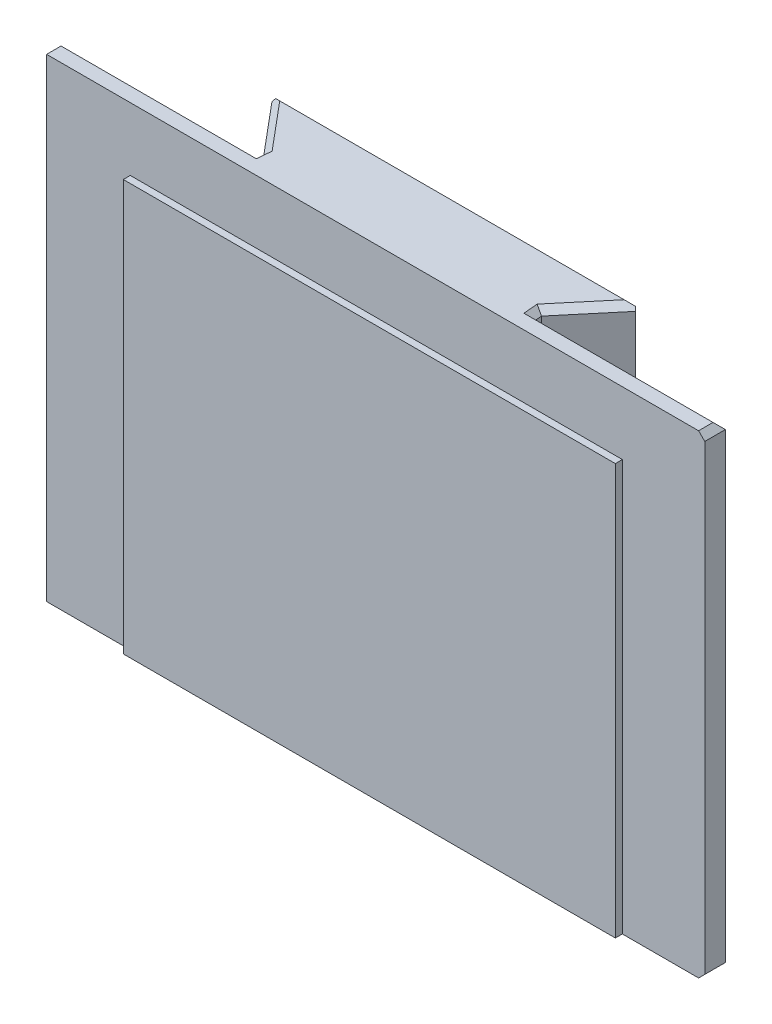
ISO-10303-21;
HEADER;
FILE_DESCRIPTION(('STEP AP214'),'2;1');
FILE_NAME('part.step','',(''),(''),'','','');
FILE_SCHEMA(('AUTOMOTIVE_DESIGN { 1 0 10303 214 1 1 1 1 }'));
ENDSEC;
DATA;
#1=APPLICATION_CONTEXT('core data for automotive mechanical design processes');
#2=APPLICATION_PROTOCOL_DEFINITION('international standard','automotive_design',2000,#1);
#3=PRODUCT_CONTEXT('',#1,'mechanical');
#4=PRODUCT('Part','Part','',(#3));
#5=PRODUCT_RELATED_PRODUCT_CATEGORY('part','',(#4));
#6=PRODUCT_DEFINITION_FORMATION('','',#4);
#7=PRODUCT_DEFINITION_CONTEXT('part definition',#1,'design');
#8=PRODUCT_DEFINITION('design','',#6,#7);
#9=PRODUCT_DEFINITION_SHAPE('','',#8);
#10=(LENGTH_UNIT() NAMED_UNIT(*) SI_UNIT(.MILLI.,.METRE.));
#11=(NAMED_UNIT(*) PLANE_ANGLE_UNIT() SI_UNIT($,.RADIAN.));
#12=(NAMED_UNIT(*) SI_UNIT($,.STERADIAN.) SOLID_ANGLE_UNIT());
#13=UNCERTAINTY_MEASURE_WITH_UNIT(LENGTH_MEASURE(1.E-05),#10,'distance_accuracy_value','');
#14=(GEOMETRIC_REPRESENTATION_CONTEXT(3) GLOBAL_UNCERTAINTY_ASSIGNED_CONTEXT((#13)) GLOBAL_UNIT_ASSIGNED_CONTEXT((#10,
#11,#12)) REPRESENTATION_CONTEXT('',''));
#15=CARTESIAN_POINT('',(0.,0.,0.));
#16=DIRECTION('',(0.,0.,1.));
#17=DIRECTION('',(1.,0.,0.));
#18=AXIS2_PLACEMENT_3D('',#15,#16,#17);
#19=CARTESIAN_POINT('',(0.,0.,-16.));
#20=DIRECTION('',(0.,0.,-1.));
#21=DIRECTION('',(-1.,0.,0.));
#22=AXIS2_PLACEMENT_3D('',#19,#20,#21);
#23=PLANE('',#22);
#24=DIRECTION('',(0.,1.,0.));
#25=VECTOR('',#24,1.);
#26=CARTESIAN_POINT('',(139.416621160774,109.497,-16.));
#27=LINE('',#26,#25);
#28=CARTESIAN_POINT('',(139.416621160774,-4.00299999999999,-16.));
#29=VERTEX_POINT('',#28);
#30=CARTESIAN_POINT('',(139.416621160774,107.997,-16.));
#31=VERTEX_POINT('',#30);
#32=EDGE_CURVE('E298',#29,#31,#27,.T.);
#33=ORIENTED_EDGE('',*,*,#32,.T.);
#34=DIRECTION('',(1.,0.,0.));
#35=VECTOR('',#34,1.);
#36=CARTESIAN_POINT('',(185.4335,107.997,-16.));
#37=LINE('',#36,#35);
#38=CARTESIAN_POINT('',(185.4335,107.997,-16.));
#39=VERTEX_POINT('',#38);
#40=EDGE_CURVE('E364',#31,#39,#37,.T.);
#41=ORIENTED_EDGE('',*,*,#40,.T.);
#42=DIRECTION('',(0.,-1.,0.));
#43=VECTOR('',#42,1.);
#44=CARTESIAN_POINT('',(185.4335,109.497,-16.));
#45=LINE('',#44,#43);
#46=CARTESIAN_POINT('',(185.4335,-4.00299999999999,-16.));
#47=VERTEX_POINT('',#46);
#48=EDGE_CURVE('E245',#39,#47,#45,.T.);
#49=ORIENTED_EDGE('',*,*,#48,.T.);
#50=DIRECTION('',(-1.,0.,0.));
#51=VECTOR('',#50,1.);
#52=CARTESIAN_POINT('',(139.416621160774,-4.00299999999999,-16.));
#53=LINE('',#52,#51);
#54=EDGE_CURVE('E362',#47,#29,#53,.T.);
#55=ORIENTED_EDGE('',*,*,#54,.T.);
#56=EDGE_LOOP('',(#33,#41,#49,#55));
#57=FACE_BOUND('',#56,.T.);
#58=ADVANCED_FACE('F41',(#57),#23,.T.);
#59=CARTESIAN_POINT('',(46.0335,-5.50299999999999,-166.552081310409));
#60=DIRECTION('',(1.,0.,0.));
#61=DIRECTION('',(0.,1.,0.));
#62=AXIS2_PLACEMENT_3D('',#59,#60,#61);
#63=PLANE('',#62);
#64=DIRECTION('',(0.,1.,0.));
#65=VECTOR('',#64,1.);
#66=CARTESIAN_POINT('',(46.0335,-5.50299999999999,-11.));
#67=LINE('',#66,#65);
#68=CARTESIAN_POINT('',(46.0335,-5.50299999999999,-11.));
#69=VERTEX_POINT('',#68);
#70=CARTESIAN_POINT('',(46.0335,94.197,-11.));
#71=VERTEX_POINT('',#70);
#72=EDGE_CURVE('E253',#69,#71,#67,.T.);
#73=ORIENTED_EDGE('',*,*,#72,.F.);
#74=DIRECTION('',(0.,0.,1.));
#75=VECTOR('',#74,1.);
#76=CARTESIAN_POINT('',(46.0335,-5.50299999999999,-166.552081310409));
#77=LINE('',#76,#75);
#78=CARTESIAN_POINT('',(46.0335,-5.50299999999999,-9.3));
#79=VERTEX_POINT('',#78);
#80=EDGE_CURVE('E227',#69,#79,#77,.T.);
#81=ORIENTED_EDGE('',*,*,#80,.T.);
#82=DIRECTION('',(0.,1.,0.));
#83=VECTOR('',#82,1.);
#84=CARTESIAN_POINT('',(46.0335,-5.50299999999999,-9.3));
#85=LINE('',#84,#83);
#86=CARTESIAN_POINT('',(46.0335,94.197,-9.3));
#87=VERTEX_POINT('',#86);
#88=EDGE_CURVE('E263',#79,#87,#85,.T.);
#89=ORIENTED_EDGE('',*,*,#88,.T.);
#90=DIRECTION('',(0.,0.,1.));
#91=VECTOR('',#90,1.);
#92=CARTESIAN_POINT('',(46.0335,94.197,-166.552081310409));
#93=LINE('',#92,#91);
#94=EDGE_CURVE('E262',#71,#87,#93,.T.);
#95=ORIENTED_EDGE('',*,*,#94,.F.);
#96=EDGE_LOOP('',(#73,#81,#89,#95));
#97=FACE_BOUND('',#96,.T.);
#98=ADVANCED_FACE('F453',(#97),#63,.F.);
#99=CARTESIAN_POINT('',(46.0335,94.197,-166.552081310409));
#100=DIRECTION('',(0.,-1.,0.));
#101=DIRECTION('',(0.,0.,-1.));
#102=AXIS2_PLACEMENT_3D('',#99,#100,#101);
#103=PLANE('',#102);
#104=DIRECTION('',(1.,0.,0.));
#105=VECTOR('',#104,1.);
#106=CARTESIAN_POINT('',(46.0335,94.197,-11.));
#107=LINE('',#106,#105);
#108=CARTESIAN_POINT('',(165.4335,94.197,-11.));
#109=VERTEX_POINT('',#108);
#110=EDGE_CURVE('E270',#71,#109,#107,.T.);
#111=ORIENTED_EDGE('',*,*,#110,.F.);
#112=ORIENTED_EDGE('',*,*,#94,.T.);
#113=DIRECTION('',(1.,0.,0.));
#114=VECTOR('',#113,1.);
#115=CARTESIAN_POINT('',(46.0335,94.197,-9.3));
#116=LINE('',#115,#114);
#117=CARTESIAN_POINT('',(165.4335,94.197,-9.3));
#118=VERTEX_POINT('',#117);
#119=EDGE_CURVE('E259',#87,#118,#116,.T.);
#120=ORIENTED_EDGE('',*,*,#119,.T.);
#121=DIRECTION('',(0.,0.,1.));
#122=VECTOR('',#121,1.);
#123=CARTESIAN_POINT('',(165.4335,94.197,-166.552081310409));
#124=LINE('',#123,#122);
#125=EDGE_CURVE('E258',#109,#118,#124,.T.);
#126=ORIENTED_EDGE('',*,*,#125,.F.);
#127=EDGE_LOOP('',(#111,#112,#120,#126));
#128=FACE_BOUND('',#127,.T.);
#129=ADVANCED_FACE('F444',(#128),#103,.F.);
#130=CARTESIAN_POINT('',(165.4335,94.197,-166.552081310409));
#131=DIRECTION('',(-1.,0.,0.));
#132=DIRECTION('',(0.,-1.,0.));
#133=AXIS2_PLACEMENT_3D('',#130,#131,#132);
#134=PLANE('',#133);
#135=DIRECTION('',(0.,-1.,0.));
#136=VECTOR('',#135,1.);
#137=CARTESIAN_POINT('',(165.4335,94.197,-11.));
#138=LINE('',#137,#136);
#139=CARTESIAN_POINT('',(165.4335,-5.50299999999999,-11.));
#140=VERTEX_POINT('',#139);
#141=EDGE_CURVE('E266',#109,#140,#138,.T.);
#142=ORIENTED_EDGE('',*,*,#141,.F.);
#143=ORIENTED_EDGE('',*,*,#125,.T.);
#144=DIRECTION('',(0.,-1.,0.));
#145=VECTOR('',#144,1.);
#146=CARTESIAN_POINT('',(165.4335,94.197,-9.3));
#147=LINE('',#146,#145);
#148=CARTESIAN_POINT('',(165.4335,-5.50299999999999,-9.3));
#149=VERTEX_POINT('',#148);
#150=EDGE_CURVE('E255',#118,#149,#147,.T.);
#151=ORIENTED_EDGE('',*,*,#150,.T.);
#152=DIRECTION('',(0.,0.,1.));
#153=VECTOR('',#152,1.);
#154=CARTESIAN_POINT('',(165.4335,-5.50299999999999,-166.552081310409));
#155=LINE('',#154,#153);
#156=EDGE_CURVE('E254',#140,#149,#155,.T.);
#157=ORIENTED_EDGE('',*,*,#156,.F.);
#158=EDGE_LOOP('',(#142,#143,#151,#157));
#159=FACE_BOUND('',#158,.T.);
#160=ADVANCED_FACE('F442',(#159),#134,.F.);
#161=CARTESIAN_POINT('',(165.4335,-5.50299999999999,-166.552081310409));
#162=DIRECTION('',(0.,1.,0.));
#163=DIRECTION('',(0.,0.,1.));
#164=AXIS2_PLACEMENT_3D('',#161,#162,#163);
#165=PLANE('',#164);
#166=DIRECTION('',(0.,0.,1.));
#167=VECTOR('',#166,1.);
#168=CARTESIAN_POINT('',(25.7335,-5.50299999999999,-16.));
#169=LINE('',#168,#167);
#170=CARTESIAN_POINT('',(25.7335,-5.50299999999999,-14.5));
#171=VERTEX_POINT('',#170);
#172=CARTESIAN_POINT('',(25.7335,-5.50299999999999,-11.));
#173=VERTEX_POINT('',#172);
#174=EDGE_CURVE('E218',#171,#173,#169,.T.);
#175=ORIENTED_EDGE('',*,*,#174,.F.);
#176=DIRECTION('',(1.,0.,0.));
#177=VECTOR('',#176,1.);
#178=CARTESIAN_POINT('',(71.7503788392264,-5.50299999999999,-14.5));
#179=LINE('',#178,#177);
#180=CARTESIAN_POINT('',(73.1248756002525,-5.50299999999999,-14.5));
#181=VERTEX_POINT('',#180);
#182=EDGE_CURVE('E12',#171,#181,#179,.T.);
#183=ORIENTED_EDGE('',*,*,#182,.T.);
#184=DIRECTION('',(0.0871557427476643,0.,-0.996194698091745));
#185=VECTOR('',#184,1.);
#186=CARTESIAN_POINT('',(87.0278467257539,-5.50299999999999,-173.41168712825));
#187=LINE('',#186,#185);
#188=CARTESIAN_POINT('',(73.4328629314511,-5.50299999999999,-18.0203113041871));
#189=VERTEX_POINT('',#188);
#190=EDGE_CURVE('E51',#181,#189,#187,.T.);
#191=ORIENTED_EDGE('',*,*,#190,.T.);
#192=DIRECTION('',(-0.642787609686543,0.,-0.766044443118975));
#193=VECTOR('',#192,1.);
#194=CARTESIAN_POINT('',(62.6450780011525,-5.50299999999999,-30.8766927510039));
#195=LINE('',#194,#193);
#196=CARTESIAN_POINT('',(63.8002603807643,-5.50299999999999,-29.5));
#197=VERTEX_POINT('',#196);
#198=EDGE_CURVE('E384',#189,#197,#195,.T.);
#199=ORIENTED_EDGE('',*,*,#198,.T.);
#200=DIRECTION('',(1.,0.,0.));
#201=VECTOR('',#200,1.);
#202=CARTESIAN_POINT('',(148.5835,-5.50299999999999,-29.5));
#203=LINE('',#202,#201);
#204=CARTESIAN_POINT('',(147.366739619236,-5.50299999999999,-29.5));
#205=VERTEX_POINT('',#204);
#206=EDGE_CURVE('E382',#197,#205,#203,.T.);
#207=ORIENTED_EDGE('',*,*,#206,.T.);
#208=DIRECTION('',(-0.642787609686543,0.,0.766044443118975));
#209=VECTOR('',#208,1.);
#210=CARTESIAN_POINT('',(138.133514087035,-5.50299999999999,-18.4962703007677));
#211=LINE('',#210,#209);
#212=CARTESIAN_POINT('',(137.734137068549,-5.50299999999999,-18.0203113041871));
#213=VERTEX_POINT('',#212);
#214=EDGE_CURVE('E380',#205,#213,#211,.T.);
#215=ORIENTED_EDGE('',*,*,#214,.T.);
#216=DIRECTION('',(0.0871557427476733,0.,0.996194698091744));
#217=VECTOR('',#216,1.);
#218=CARTESIAN_POINT('',(125.048409256464,-5.50299999999999,-163.018843694883));
#219=LINE('',#218,#217);
#220=CARTESIAN_POINT('',(138.042124399748,-5.50299999999999,-14.5));
#221=VERTEX_POINT('',#220);
#222=EDGE_CURVE('E378',#213,#221,#219,.T.);
#223=ORIENTED_EDGE('',*,*,#222,.T.);
#224=DIRECTION('',(1.,0.,0.));
#225=VECTOR('',#224,1.);
#226=CARTESIAN_POINT('',(185.4335,-5.50299999999999,-14.5));
#227=LINE('',#226,#225);
#228=CARTESIAN_POINT('',(183.9335,-5.50299999999999,-14.5));
#229=VERTEX_POINT('',#228);
#230=EDGE_CURVE('E376',#221,#229,#227,.T.);
#231=ORIENTED_EDGE('',*,*,#230,.T.);
#232=DIRECTION('',(0.,0.,1.));
#233=VECTOR('',#232,1.);
#234=CARTESIAN_POINT('',(183.9335,-5.50299999999999,-166.552081310409));
#235=LINE('',#234,#233);
#236=CARTESIAN_POINT('',(183.9335,-5.50299999999999,-11.));
#237=VERTEX_POINT('',#236);
#238=EDGE_CURVE('E374',#229,#237,#235,.T.);
#239=ORIENTED_EDGE('',*,*,#238,.T.);
#240=DIRECTION('',(-1.,0.,0.));
#241=VECTOR('',#240,1.);
#242=CARTESIAN_POINT('',(185.4335,-5.50299999999999,-11.));
#243=LINE('',#242,#241);
#244=EDGE_CURVE('E237',#237,#140,#243,.T.);
#245=ORIENTED_EDGE('',*,*,#244,.T.);
#246=ORIENTED_EDGE('',*,*,#156,.T.);
#247=DIRECTION('',(-1.,0.,0.));
#248=VECTOR('',#247,1.);
#249=CARTESIAN_POINT('',(165.4335,-5.50299999999999,-9.3));
#250=LINE('',#249,#248);
#251=EDGE_CURVE('E251',#149,#79,#250,.T.);
#252=ORIENTED_EDGE('',*,*,#251,.T.);
#253=ORIENTED_EDGE('',*,*,#80,.F.);
#254=EDGE_CURVE('E231',#69,#173,#243,.T.);
#255=ORIENTED_EDGE('',*,*,#254,.T.);
#256=EDGE_LOOP('',(#175,#183,#191,#199,#207,#215,#223,#231,#239,#245,#246,#252,#253,#255));
#257=FACE_BOUND('',#256,.T.);
#258=ADVANCED_FACE('F232',(#257),#165,.F.);
#259=CARTESIAN_POINT('',(0.,0.,-9.3));
#260=DIRECTION('',(0.,0.,-1.));
#261=DIRECTION('',(-1.,0.,0.));
#262=AXIS2_PLACEMENT_3D('',#259,#260,#261);
#263=PLANE('',#262);
#264=ORIENTED_EDGE('',*,*,#88,.F.);
#265=ORIENTED_EDGE('',*,*,#251,.F.);
#266=ORIENTED_EDGE('',*,*,#150,.F.);
#267=ORIENTED_EDGE('',*,*,#119,.F.);
#268=EDGE_LOOP('',(#264,#265,#266,#267));
#269=FACE_BOUND('',#268,.T.);
#270=ADVANCED_FACE('F451',(#269),#263,.F.);
#271=CARTESIAN_POINT('',(0.,0.,-11.));
#272=DIRECTION('',(0.,0.,-1.));
#273=DIRECTION('',(-1.,0.,0.));
#274=AXIS2_PLACEMENT_3D('',#271,#272,#273);
#275=PLANE('',#274);
#276=DIRECTION('',(0.,-1.,0.));
#277=VECTOR('',#276,1.);
#278=CARTESIAN_POINT('',(185.4335,109.497,-11.));
#279=LINE('',#278,#277);
#280=CARTESIAN_POINT('',(185.4335,107.997,-11.));
#281=VERTEX_POINT('',#280);
#282=CARTESIAN_POINT('',(185.4335,-4.00299999999999,-11.));
#283=VERTEX_POINT('',#282);
#284=EDGE_CURVE('E238',#281,#283,#279,.T.);
#285=ORIENTED_EDGE('',*,*,#284,.F.);
#286=DIRECTION('',(0.707106781186548,-0.707106781186548,0.));
#287=VECTOR('',#286,1.);
#288=CARTESIAN_POINT('',(185.4335,107.997,-11.));
#289=LINE('',#288,#287);
#290=CARTESIAN_POINT('',(183.9335,109.497,-11.));
#291=VERTEX_POINT('',#290);
#292=EDGE_CURVE('E372',#281,#291,#289,.F.);
#293=ORIENTED_EDGE('',*,*,#292,.T.);
#294=DIRECTION('',(1.,0.,0.));
#295=VECTOR('',#294,1.);
#296=CARTESIAN_POINT('',(185.4335,109.497,-11.));
#297=LINE('',#296,#295);
#298=CARTESIAN_POINT('',(25.7335,109.497,-11.));
#299=VERTEX_POINT('',#298);
#300=EDGE_CURVE('E243',#299,#291,#297,.T.);
#301=ORIENTED_EDGE('',*,*,#300,.F.);
#302=DIRECTION('',(0.,1.,0.));
#303=VECTOR('',#302,1.);
#304=CARTESIAN_POINT('',(25.7335,109.497,-11.));
#305=LINE('',#304,#303);
#306=EDGE_CURVE('E223',#173,#299,#305,.T.);
#307=ORIENTED_EDGE('',*,*,#306,.F.);
#308=ORIENTED_EDGE('',*,*,#254,.F.);
#309=ORIENTED_EDGE('',*,*,#72,.T.);
#310=ORIENTED_EDGE('',*,*,#110,.T.);
#311=ORIENTED_EDGE('',*,*,#141,.T.);
#312=ORIENTED_EDGE('',*,*,#244,.F.);
#313=DIRECTION('',(-0.707106781186548,-0.707106781186548,0.));
#314=VECTOR('',#313,1.);
#315=CARTESIAN_POINT('',(183.9335,-5.50299999999999,-11.));
#316=LINE('',#315,#314);
#317=EDGE_CURVE('E370',#237,#283,#316,.F.);
#318=ORIENTED_EDGE('',*,*,#317,.T.);
#319=EDGE_LOOP('',(#285,#293,#301,#307,#308,#309,#310,#311,#312,#318));
#320=FACE_BOUND('',#319,.T.);
#321=ADVANCED_FACE('F241',(#320),#275,.F.);
#322=CARTESIAN_POINT('',(185.4335,109.497,-16.));
#323=DIRECTION('',(-1.,0.,0.));
#324=DIRECTION('',(0.,0.,1.));
#325=AXIS2_PLACEMENT_3D('',#322,#323,#324);
#326=PLANE('',#325);
#327=ORIENTED_EDGE('',*,*,#48,.F.);
#328=DIRECTION('',(0.,0.,1.));
#329=VECTOR('',#328,1.);
#330=CARTESIAN_POINT('',(185.4335,107.997,-16.));
#331=LINE('',#330,#329);
#332=EDGE_CURVE('E368',#39,#281,#331,.T.);
#333=ORIENTED_EDGE('',*,*,#332,.T.);
#334=ORIENTED_EDGE('',*,*,#284,.T.);
#335=DIRECTION('',(0.,0.,-1.));
#336=VECTOR('',#335,1.);
#337=CARTESIAN_POINT('',(185.4335,-4.00299999999999,-16.));
#338=LINE('',#337,#336);
#339=EDGE_CURVE('E366',#283,#47,#338,.T.);
#340=ORIENTED_EDGE('',*,*,#339,.T.);
#341=EDGE_LOOP('',(#327,#333,#334,#340));
#342=FACE_BOUND('',#341,.T.);
#343=ADVANCED_FACE('F709',(#342),#326,.F.);
#344=CARTESIAN_POINT('',(25.7335,109.497,-16.));
#345=DIRECTION('',(1.,0.,0.));
#346=DIRECTION('',(0.,1.,0.));
#347=AXIS2_PLACEMENT_3D('',#344,#345,#346);
#348=PLANE('',#347);
#349=DIRECTION('',(0.,0.,1.));
#350=VECTOR('',#349,1.);
#351=CARTESIAN_POINT('',(25.7335,109.497,-16.));
#352=LINE('',#351,#350);
#353=CARTESIAN_POINT('',(25.7335,109.497,-14.5));
#354=VERTEX_POINT('',#353);
#355=EDGE_CURVE('E228',#354,#299,#352,.T.);
#356=ORIENTED_EDGE('',*,*,#355,.F.);
#357=DIRECTION('',(0.,-0.707106781186548,-0.707106781186548));
#358=VECTOR('',#357,1.);
#359=CARTESIAN_POINT('',(25.7335,107.997,-16.));
#360=LINE('',#359,#358);
#361=CARTESIAN_POINT('',(25.7335,107.997,-16.));
#362=VERTEX_POINT('',#361);
#363=EDGE_CURVE('E324',#354,#362,#360,.T.);
#364=ORIENTED_EDGE('',*,*,#363,.T.);
#365=DIRECTION('',(0.,1.,0.));
#366=VECTOR('',#365,1.);
#367=CARTESIAN_POINT('',(25.7335,109.497,-16.));
#368=LINE('',#367,#366);
#369=CARTESIAN_POINT('',(25.7335,-4.00299999999999,-16.));
#370=VERTEX_POINT('',#369);
#371=EDGE_CURVE('E249',#370,#362,#368,.T.);
#372=ORIENTED_EDGE('',*,*,#371,.F.);
#373=DIRECTION('',(0.,-0.707106781186544,0.707106781186551));
#374=VECTOR('',#373,1.);
#375=CARTESIAN_POINT('',(25.7335,-4.003,-16.));
#376=LINE('',#375,#374);
#377=EDGE_CURVE('E226',#370,#171,#376,.T.);
#378=ORIENTED_EDGE('',*,*,#377,.T.);
#379=ORIENTED_EDGE('',*,*,#174,.T.);
#380=ORIENTED_EDGE('',*,*,#306,.T.);
#381=EDGE_LOOP('',(#356,#364,#372,#378,#379,#380));
#382=FACE_BOUND('',#381,.T.);
#383=ADVANCED_FACE('F221',(#382),#348,.F.);
#384=CARTESIAN_POINT('',(185.4335,109.497,-16.));
#385=DIRECTION('',(0.,-1.,0.));
#386=DIRECTION('',(0.,0.,-1.));
#387=AXIS2_PLACEMENT_3D('',#384,#385,#386);
#388=PLANE('',#387);
#389=DIRECTION('',(-0.0871557427476643,0.,0.996194698091745));
#390=VECTOR('',#389,1.);
#391=CARTESIAN_POINT('',(74.1082219138729,109.497,-25.7396997964078));
#392=LINE('',#391,#390);
#393=CARTESIAN_POINT('',(73.4328629314511,109.497,-18.0203113041871));
#394=VERTEX_POINT('',#393);
#395=CARTESIAN_POINT('',(73.1248756002525,109.497,-14.5));
#396=VERTEX_POINT('',#395);
#397=EDGE_CURVE('E319',#394,#396,#392,.T.);
#398=ORIENTED_EDGE('',*,*,#397,.T.);
#399=DIRECTION('',(-1.,0.,0.));
#400=VECTOR('',#399,1.);
#401=CARTESIAN_POINT('',(25.7335,109.497,-14.5));
#402=LINE('',#401,#400);
#403=EDGE_CURVE('E321',#396,#354,#402,.T.);
#404=ORIENTED_EDGE('',*,*,#403,.T.);
#405=ORIENTED_EDGE('',*,*,#355,.T.);
#406=ORIENTED_EDGE('',*,*,#300,.T.);
#407=DIRECTION('',(0.,0.,-1.));
#408=VECTOR('',#407,1.);
#409=CARTESIAN_POINT('',(183.9335,109.497,-16.));
#410=LINE('',#409,#408);
#411=CARTESIAN_POINT('',(183.9335,109.497,-14.5));
#412=VERTEX_POINT('',#411);
#413=EDGE_CURVE('E307',#291,#412,#410,.T.);
#414=ORIENTED_EDGE('',*,*,#413,.T.);
#415=DIRECTION('',(-1.,0.,0.));
#416=VECTOR('',#415,1.);
#417=CARTESIAN_POINT('',(139.416621160774,109.497,-14.5));
#418=LINE('',#417,#416);
#419=CARTESIAN_POINT('',(138.042124399748,109.497,-14.5));
#420=VERTEX_POINT('',#419);
#421=EDGE_CURVE('E309',#412,#420,#418,.T.);
#422=ORIENTED_EDGE('',*,*,#421,.T.);
#423=DIRECTION('',(-0.0871557427476733,0.,-0.996194698091744));
#424=VECTOR('',#423,1.);
#425=CARTESIAN_POINT('',(138.271879008103,109.497,-11.873892809702));
#426=LINE('',#425,#424);
#427=CARTESIAN_POINT('',(137.734137068549,109.497,-18.0203113041871));
#428=VERTEX_POINT('',#427);
#429=EDGE_CURVE('E311',#420,#428,#426,.T.);
#430=ORIENTED_EDGE('',*,*,#429,.T.);
#431=DIRECTION('',(0.642787609686543,0.,-0.766044443118975));
#432=VECTOR('',#431,1.);
#433=CARTESIAN_POINT('',(148.521921998847,109.497,-30.8766927510039));
#434=LINE('',#433,#432);
#435=CARTESIAN_POINT('',(147.366739619236,109.497,-29.5));
#436=VERTEX_POINT('',#435);
#437=EDGE_CURVE('E313',#428,#436,#434,.T.);
#438=ORIENTED_EDGE('',*,*,#437,.T.);
#439=DIRECTION('',(-1.,0.,0.));
#440=VECTOR('',#439,1.);
#441=CARTESIAN_POINT('',(62.5835,109.497,-29.5));
#442=LINE('',#441,#440);
#443=CARTESIAN_POINT('',(63.8002603807643,109.497,-29.5));
#444=VERTEX_POINT('',#443);
#445=EDGE_CURVE('E315',#436,#444,#442,.T.);
#446=ORIENTED_EDGE('',*,*,#445,.T.);
#447=DIRECTION('',(0.642787609686543,0.,0.766044443118975));
#448=VECTOR('',#447,1.);
#449=CARTESIAN_POINT('',(73.0334859129647,109.497,-18.4962703007677));
#450=LINE('',#449,#448);
#451=EDGE_CURVE('E317',#444,#394,#450,.T.);
#452=ORIENTED_EDGE('',*,*,#451,.T.);
#453=EDGE_LOOP('',(#398,#404,#405,#406,#414,#422,#430,#438,#446,#452));
#454=FACE_BOUND('',#453,.T.);
#455=ADVANCED_FACE('F693',(#454),#388,.F.);
#456=ORIENTED_EDGE('',*,*,#371,.T.);
#457=DIRECTION('',(1.,0.,0.));
#458=VECTOR('',#457,1.);
#459=CARTESIAN_POINT('',(71.7503788392264,107.997,-16.));
#460=LINE('',#459,#458);
#461=CARTESIAN_POINT('',(71.7503788392264,107.997,-16.));
#462=VERTEX_POINT('',#461);
#463=EDGE_CURVE('E304',#362,#462,#460,.T.);
#464=ORIENTED_EDGE('',*,*,#463,.T.);
#465=DIRECTION('',(0.,-1.,0.));
#466=VECTOR('',#465,1.);
#467=CARTESIAN_POINT('',(71.7503788392264,-5.50299999999999,-16.));
#468=LINE('',#467,#466);
#469=CARTESIAN_POINT('',(71.7503788392264,-4.00299999999999,-16.));
#470=VERTEX_POINT('',#469);
#471=EDGE_CURVE('E283',#462,#470,#468,.T.);
#472=ORIENTED_EDGE('',*,*,#471,.T.);
#473=DIRECTION('',(-1.,0.,0.));
#474=VECTOR('',#473,1.);
#475=CARTESIAN_POINT('',(25.7335,-4.00299999999999,-16.));
#476=LINE('',#475,#474);
#477=EDGE_CURVE('E301',#470,#370,#476,.T.);
#478=ORIENTED_EDGE('',*,*,#477,.T.);
#479=EDGE_LOOP('',(#456,#464,#472,#478));
#480=FACE_BOUND('',#479,.T.);
#481=ADVANCED_FACE('F463',(#480),#23,.T.);
#482=CARTESIAN_POINT('',(60.5835,-96.7444379544733,-31.));
#483=DIRECTION('',(-0.766044443118975,0.,0.642787609686543));
#484=DIRECTION('',(0.642787609686543,0.,0.766044443118975));
#485=AXIS2_PLACEMENT_3D('',#482,#483,#484);
#486=PLANE('',#485);
#487=DIRECTION('',(0.,1.,0.));
#488=VECTOR('',#487,1.);
#489=CARTESIAN_POINT('',(71.8844192482863,109.497,-17.5320888862379));
#490=LINE('',#489,#488);
#491=CARTESIAN_POINT('',(71.8844192482863,-4.00299999999999,-17.5320888862379));
#492=VERTEX_POINT('',#491);
#493=CARTESIAN_POINT('',(71.8844192482863,107.997,-17.5320888862379));
#494=VERTEX_POINT('',#493);
#495=EDGE_CURVE('E280',#492,#494,#490,.T.);
#496=ORIENTED_EDGE('',*,*,#495,.T.);
#497=DIRECTION('',(-0.642787609686543,0.,-0.766044443118975));
#498=VECTOR('',#497,1.);
#499=CARTESIAN_POINT('',(61.4960113364741,107.997,-29.9125113364741));
#500=LINE('',#499,#498);
#501=CARTESIAN_POINT('',(61.4960113364741,107.997,-29.9125113364741));
#502=VERTEX_POINT('',#501);
#503=EDGE_CURVE('E332',#494,#502,#500,.T.);
#504=ORIENTED_EDGE('',*,*,#503,.T.);
#505=DIRECTION('',(0.,-1.,0.));
#506=VECTOR('',#505,1.);
#507=CARTESIAN_POINT('',(61.4960113364741,-96.7444379544733,-29.9125113364741));
#508=LINE('',#507,#506);
#509=CARTESIAN_POINT('',(61.4960113364741,-4.00299999999999,-29.9125113364741));
#510=VERTEX_POINT('',#509);
#511=EDGE_CURVE('E269',#502,#510,#508,.T.);
#512=ORIENTED_EDGE('',*,*,#511,.T.);
#513=DIRECTION('',(0.642787609686543,0.,0.766044443118975));
#514=VECTOR('',#513,1.);
#515=CARTESIAN_POINT('',(71.8844192482863,-4.003,-17.5320888862379));
#516=LINE('',#515,#514);
#517=EDGE_CURVE('E330',#510,#492,#516,.T.);
#518=ORIENTED_EDGE('',*,*,#517,.T.);
#519=EDGE_LOOP('',(#496,#504,#512,#518));
#520=FACE_BOUND('',#519,.T.);
#521=ADVANCED_FACE('F676',(#520),#486,.T.);
#522=CARTESIAN_POINT('',(150.5835,-96.7444379544733,-31.));
#523=DIRECTION('',(0.,0.,-1.));
#524=DIRECTION('',(-1.,0.,0.));
#525=AXIS2_PLACEMENT_3D('',#522,#523,#524);
#526=PLANE('',#525);
#527=DIRECTION('',(0.,1.,0.));
#528=VECTOR('',#527,1.);
#529=CARTESIAN_POINT('',(62.5835,-96.7444379544733,-31.));
#530=LINE('',#529,#528);
#531=CARTESIAN_POINT('',(62.5835,-4.00299999999999,-31.));
#532=VERTEX_POINT('',#531);
#533=CARTESIAN_POINT('',(62.5835,107.997,-31.));
#534=VERTEX_POINT('',#533);
#535=EDGE_CURVE('E289',#532,#534,#530,.T.);
#536=ORIENTED_EDGE('',*,*,#535,.T.);
#537=DIRECTION('',(1.,0.,0.));
#538=VECTOR('',#537,1.);
#539=CARTESIAN_POINT('',(148.5835,107.997,-31.));
#540=LINE('',#539,#538);
#541=CARTESIAN_POINT('',(148.5835,107.997,-31.));
#542=VERTEX_POINT('',#541);
#543=EDGE_CURVE('E344',#534,#542,#540,.T.);
#544=ORIENTED_EDGE('',*,*,#543,.T.);
#545=DIRECTION('',(0.,-1.,0.));
#546=VECTOR('',#545,1.);
#547=CARTESIAN_POINT('',(148.5835,-96.7444379544733,-31.));
#548=LINE('',#547,#546);
#549=CARTESIAN_POINT('',(148.5835,-4.00299999999999,-31.));
#550=VERTEX_POINT('',#549);
#551=EDGE_CURVE('E286',#542,#550,#548,.T.);
#552=ORIENTED_EDGE('',*,*,#551,.T.);
#553=DIRECTION('',(-1.,0.,0.));
#554=VECTOR('',#553,1.);
#555=CARTESIAN_POINT('',(62.5835,-4.00299999999999,-31.));
#556=LINE('',#555,#554);
#557=EDGE_CURVE('E342',#550,#532,#556,.T.);
#558=ORIENTED_EDGE('',*,*,#557,.T.);
#559=EDGE_LOOP('',(#536,#544,#552,#558));
#560=FACE_BOUND('',#559,.T.);
#561=ADVANCED_FACE('F667',(#560),#526,.T.);
#562=CARTESIAN_POINT('',(137.997005532341,-96.7444379544733,-16.));
#563=DIRECTION('',(0.766044443118975,0.,0.642787609686543));
#564=DIRECTION('',(0.642787609686543,0.,-0.766044443118975));
#565=AXIS2_PLACEMENT_3D('',#562,#563,#564);
#566=PLANE('',#565);
#567=DIRECTION('',(0.,1.,0.));
#568=VECTOR('',#567,1.);
#569=CARTESIAN_POINT('',(149.670988663526,-96.7444379544733,-29.9125113364741));
#570=LINE('',#569,#568);
#571=CARTESIAN_POINT('',(149.670988663526,-4.00299999999999,-29.9125113364741));
#572=VERTEX_POINT('',#571);
#573=CARTESIAN_POINT('',(149.670988663526,107.997,-29.9125113364741));
#574=VERTEX_POINT('',#573);
#575=EDGE_CURVE('E295',#572,#574,#570,.T.);
#576=ORIENTED_EDGE('',*,*,#575,.T.);
#577=DIRECTION('',(-0.642787609686543,0.,0.766044443118975));
#578=VECTOR('',#577,1.);
#579=CARTESIAN_POINT('',(139.282580751714,107.997,-17.5320888862379));
#580=LINE('',#579,#578);
#581=CARTESIAN_POINT('',(139.282580751714,107.997,-17.5320888862379));
#582=VERTEX_POINT('',#581);
#583=EDGE_CURVE('E356',#574,#582,#580,.T.);
#584=ORIENTED_EDGE('',*,*,#583,.T.);
#585=DIRECTION('',(0.,-1.,0.));
#586=VECTOR('',#585,1.);
#587=CARTESIAN_POINT('',(139.282580751714,-5.50299999999999,-17.5320888862379));
#588=LINE('',#587,#586);
#589=CARTESIAN_POINT('',(139.282580751714,-4.00299999999999,-17.5320888862379));
#590=VERTEX_POINT('',#589);
#591=EDGE_CURVE('E292',#582,#590,#588,.T.);
#592=ORIENTED_EDGE('',*,*,#591,.T.);
#593=DIRECTION('',(0.642787609686543,0.,-0.766044443118975));
#594=VECTOR('',#593,1.);
#595=CARTESIAN_POINT('',(149.670988663526,-4.00299999999999,-29.9125113364741));
#596=LINE('',#595,#594);
#597=EDGE_CURVE('E354',#590,#572,#596,.T.);
#598=ORIENTED_EDGE('',*,*,#597,.T.);
#599=EDGE_LOOP('',(#576,#584,#592,#598));
#600=FACE_BOUND('',#599,.T.);
#601=ADVANCED_FACE('F474',(#600),#566,.T.);
#602=CARTESIAN_POINT('',(71.8844192482863,-96.7444379544733,-17.5320888862379));
#603=DIRECTION('',(-0.996194698091745,0.,-0.0871557427476643));
#604=DIRECTION('',(0.,-1.,0.));
#605=AXIS2_PLACEMENT_3D('',#602,#603,#604);
#606=PLANE('',#605);
#607=ORIENTED_EDGE('',*,*,#471,.F.);
#608=DIRECTION('',(-0.0871557427476643,0.,0.996194698091745));
#609=VECTOR('',#608,1.);
#610=CARTESIAN_POINT('',(71.8844192482863,107.997,-17.5320888862379));
#611=LINE('',#610,#609);
#612=EDGE_CURVE('E328',#462,#494,#611,.F.);
#613=ORIENTED_EDGE('',*,*,#612,.T.);
#614=ORIENTED_EDGE('',*,*,#495,.F.);
#615=DIRECTION('',(0.0871557427476643,0.,-0.996194698091745));
#616=VECTOR('',#615,1.);
#617=CARTESIAN_POINT('',(71.8844192482863,-4.00299999999999,-17.5320888862379));
#618=LINE('',#617,#616);
#619=EDGE_CURVE('E326',#492,#470,#618,.F.);
#620=ORIENTED_EDGE('',*,*,#619,.T.);
#621=EDGE_LOOP('',(#607,#613,#614,#620));
#622=FACE_BOUND('',#621,.T.);
#623=ADVANCED_FACE('F467',(#622),#606,.T.);
#624=CARTESIAN_POINT('',(62.5835,-96.7444379544733,-31.));
#625=DIRECTION('',(0.707106781186543,0.,0.707106781186552));
#626=DIRECTION('',(0.,1.,0.));
#627=AXIS2_PLACEMENT_3D('',#624,#625,#626);
#628=PLANE('',#627);
#629=ORIENTED_EDGE('',*,*,#511,.F.);
#630=DIRECTION('',(-0.500952228764616,-0.705757556807956,0.500952228764609));
#631=VECTOR('',#630,1.);
#632=CARTESIAN_POINT('',(-10.3446747754983,6.78553870991271,41.9281747754974));
#633=LINE('',#632,#631);
#634=CARTESIAN_POINT('',(61.9474702342662,108.633029765734,-30.3639702342662));
#635=VERTEX_POINT('',#634);
#636=EDGE_CURVE('E340',#502,#635,#633,.F.);
#637=ORIENTED_EDGE('',*,*,#636,.T.);
#638=DIRECTION('',(-0.577350269189631,0.577350269189623,0.577350269189623));
#639=VECTOR('',#638,1.);
#640=CARTESIAN_POINT('',(130.830645984825,39.7498540151762,-99.2471459848238));
#641=LINE('',#640,#639);
#642=EDGE_CURVE('E338',#635,#534,#641,.F.);
#643=ORIENTED_EDGE('',*,*,#642,.T.);
#644=ORIENTED_EDGE('',*,*,#535,.F.);
#645=DIRECTION('',(0.577350269189631,0.577350269189623,-0.577350269189623));
#646=VECTOR('',#645,1.);
#647=CARTESIAN_POINT('',(31.6696873485088,-34.9168126514908,-0.0861873485091744));
#648=LINE('',#647,#646);
#649=CARTESIAN_POINT('',(61.9474702342662,-4.63902976573378,-30.3639702342662));
#650=VERTEX_POINT('',#649);
#651=EDGE_CURVE('E334',#532,#650,#648,.F.);
#652=ORIENTED_EDGE('',*,*,#651,.T.);
#653=DIRECTION('',(0.500952228764615,-0.705757556807956,-0.500952228764609));
#654=VECTOR('',#653,1.);
#655=CARTESIAN_POINT('',(94.8306402505485,-50.965893682526,-63.2471402505481));
#656=LINE('',#655,#654);
#657=EDGE_CURVE('E336',#650,#510,#656,.F.);
#658=ORIENTED_EDGE('',*,*,#657,.T.);
#659=EDGE_LOOP('',(#629,#637,#643,#644,#652,#658));
#660=FACE_BOUND('',#659,.T.);
#661=ADVANCED_FACE('F473',(#660),#628,.F.);
#662=CARTESIAN_POINT('',(149.670988663526,-96.7444379544733,-29.9125113364741));
#663=DIRECTION('',(-0.707106781186538,0.,0.707106781186556));
#664=DIRECTION('',(0.,1.,0.));
#665=AXIS2_PLACEMENT_3D('',#662,#663,#664);
#666=PLANE('',#665);
#667=ORIENTED_EDGE('',*,*,#551,.F.);
#668=DIRECTION('',(-0.577350269189636,-0.577350269189621,-0.577350269189621));
#669=VECTOR('',#668,1.);
#670=CARTESIAN_POINT('',(81.0613464575256,40.4748464575274,-98.5221535424726));
#671=LINE('',#670,#669);
#672=CARTESIAN_POINT('',(149.219529765734,108.633029765734,-30.3639702342662));
#673=VERTEX_POINT('',#672);
#674=EDGE_CURVE('E352',#542,#673,#671,.F.);
#675=ORIENTED_EDGE('',*,*,#674,.T.);
#676=DIRECTION('',(-0.500952228764619,0.705757556807955,-0.500952228764607));
#677=VECTOR('',#676,1.);
#678=CARTESIAN_POINT('',(222.057492155373,6.01657369016766,42.4739921553712));
#679=LINE('',#678,#677);
#680=EDGE_CURVE('E350',#673,#574,#679,.F.);
#681=ORIENTED_EDGE('',*,*,#680,.T.);
#682=ORIENTED_EDGE('',*,*,#575,.F.);
#683=DIRECTION('',(0.500952228764619,0.705757556807956,0.500952228764606));
#684=VECTOR('',#683,1.);
#685=CARTESIAN_POINT('',(116.882177129326,-50.1969286627806,-62.7013228706736));
#686=LINE('',#685,#684);
#687=CARTESIAN_POINT('',(149.219529765734,-4.6390297657338,-30.3639702342662));
#688=VERTEX_POINT('',#687);
#689=EDGE_CURVE('E346',#572,#688,#686,.F.);
#690=ORIENTED_EDGE('',*,*,#689,.T.);
#691=DIRECTION('',(0.577350269189636,-0.577350269189621,0.577350269189621));
#692=VECTOR('',#691,1.);
#693=CARTESIAN_POINT('',(180.222305093842,-35.6418050938412,0.638805093841181));
#694=LINE('',#693,#692);
#695=EDGE_CURVE('E348',#688,#550,#694,.F.);
#696=ORIENTED_EDGE('',*,*,#695,.T.);
#697=EDGE_LOOP('',(#667,#675,#681,#682,#690,#696));
#698=FACE_BOUND('',#697,.T.);
#699=ADVANCED_FACE('F481',(#698),#666,.F.);
#700=CARTESIAN_POINT('',(139.416621160774,0.,-16.));
#701=DIRECTION('',(0.996194698091744,0.,-0.0871557427476733));
#702=DIRECTION('',(0.,-1.,0.));
#703=AXIS2_PLACEMENT_3D('',#700,#701,#702);
#704=PLANE('',#703);
#705=ORIENTED_EDGE('',*,*,#591,.F.);
#706=DIRECTION('',(-0.0871557427476733,0.,-0.996194698091744));
#707=VECTOR('',#706,1.);
#708=CARTESIAN_POINT('',(139.416621160774,107.997,-16.));
#709=LINE('',#708,#707);
#710=EDGE_CURVE('E360',#582,#31,#709,.F.);
#711=ORIENTED_EDGE('',*,*,#710,.T.);
#712=ORIENTED_EDGE('',*,*,#32,.F.);
#713=DIRECTION('',(0.0871557427476733,0.,0.996194698091744));
#714=VECTOR('',#713,1.);
#715=CARTESIAN_POINT('',(139.416621160774,-4.00299999999999,-16.));
#716=LINE('',#715,#714);
#717=EDGE_CURVE('E358',#29,#590,#716,.F.);
#718=ORIENTED_EDGE('',*,*,#717,.T.);
#719=EDGE_LOOP('',(#705,#711,#712,#718));
#720=FACE_BOUND('',#719,.T.);
#721=ADVANCED_FACE('F488',(#720),#704,.T.);
#722=CARTESIAN_POINT('',(185.4335,107.997,-16.));
#723=DIRECTION('',(-0.707106781186547,-0.707106781186547,0.));
#724=DIRECTION('',(0.,0.,1.));
#725=AXIS2_PLACEMENT_3D('',#722,#723,#724);
#726=PLANE('',#725);
#727=ORIENTED_EDGE('',*,*,#292,.F.);
#728=ORIENTED_EDGE('',*,*,#332,.F.);
#729=DIRECTION('',(0.577350269189626,-0.577350269189626,-0.577350269189626));
#730=VECTOR('',#729,1.);
#731=CARTESIAN_POINT('',(185.4335,107.997,-16.));
#732=LINE('',#731,#730);
#733=EDGE_CURVE('E404',#412,#39,#732,.T.);
#734=ORIENTED_EDGE('',*,*,#733,.F.);
#735=ORIENTED_EDGE('',*,*,#413,.F.);
#736=EDGE_LOOP('',(#727,#728,#734,#735));
#737=FACE_BOUND('',#736,.T.);
#738=ADVANCED_FACE('F495',(#737),#726,.F.);
#739=CARTESIAN_POINT('',(0.,107.997,-16.));
#740=DIRECTION('',(0.,0.707106781186547,-0.707106781186547));
#741=DIRECTION('',(-1.,0.,0.));
#742=AXIS2_PLACEMENT_3D('',#739,#740,#741);
#743=PLANE('',#742);
#744=ORIENTED_EDGE('',*,*,#733,.T.);
#745=ORIENTED_EDGE('',*,*,#40,.F.);
#746=DIRECTION('',(-0.543774795917189,0.59342605745165,0.59342605745165));
#747=VECTOR('',#746,1.);
#748=CARTESIAN_POINT('',(137.262641896983,110.347655881702,-13.6493441182981));
#749=LINE('',#748,#747);
#750=EDGE_CURVE('E401',#420,#31,#749,.F.);
#751=ORIENTED_EDGE('',*,*,#750,.F.);
#752=ORIENTED_EDGE('',*,*,#421,.F.);
#753=EDGE_LOOP('',(#744,#745,#751,#752));
#754=FACE_BOUND('',#753,.T.);
#755=ADVANCED_FACE('F539',(#754),#743,.T.);
#756=CARTESIAN_POINT('',(138.271879008103,109.497,-11.873892809702));
#757=DIRECTION('',(0.70441602640276,0.707106781186545,-0.0616284167162302));
#758=DIRECTION('',(0.0871557427476733,0.,0.996194698091744));
#759=AXIS2_PLACEMENT_3D('',#756,#757,#758);
#760=PLANE('',#759);
#761=ORIENTED_EDGE('',*,*,#750,.T.);
#762=ORIENTED_EDGE('',*,*,#710,.F.);
#763=DIRECTION('',(-0.7005142133454,0.678598344545848,-0.220871283060315));
#764=VECTOR('',#763,1.);
#765=CARTESIAN_POINT('',(143.466579450127,103.943899383003,-16.2128791639569));
#766=LINE('',#765,#764);
#767=EDGE_CURVE('E398',#428,#582,#766,.F.);
#768=ORIENTED_EDGE('',*,*,#767,.F.);
#769=ORIENTED_EDGE('',*,*,#429,.F.);
#770=EDGE_LOOP('',(#761,#762,#768,#769));
#771=FACE_BOUND('',#770,.T.);
#772=ADVANCED_FACE('F532',(#771),#760,.T.);
#773=CARTESIAN_POINT('',(156.447555691884,109.497,-40.3220951782657));
#774=DIRECTION('',(0.541675220419701,0.707106781186545,0.454519477672048));
#775=DIRECTION('',(-0.642787609686543,0.,0.766044443118975));
#776=AXIS2_PLACEMENT_3D('',#773,#774,#775);
#777=PLANE('',#776);
#778=ORIENTED_EDGE('',*,*,#583,.F.);
#779=ORIENTED_EDGE('',*,*,#680,.F.);
#780=DIRECTION('',(-0.834817129478988,0.389281620635024,0.389281620635024));
#781=VECTOR('',#780,1.);
#782=CARTESIAN_POINT('',(157.212291975728,104.905943537402,-34.0910564625984));
#783=LINE('',#782,#781);
#784=EDGE_CURVE('E395',#436,#673,#783,.F.);
#785=ORIENTED_EDGE('',*,*,#784,.F.);
#786=ORIENTED_EDGE('',*,*,#437,.F.);
#787=ORIENTED_EDGE('',*,*,#767,.T.);
#788=EDGE_LOOP('',(#778,#779,#785,#786,#787));
#789=FACE_BOUND('',#788,.T.);
#790=ADVANCED_FACE('F525',(#789),#777,.T.);
#791=CARTESIAN_POINT('',(185.4335,109.497,-29.5));
#792=DIRECTION('',(0.,0.707106781186547,-0.707106781186547));
#793=DIRECTION('',(1.,0.,0.));
#794=AXIS2_PLACEMENT_3D('',#791,#792,#793);
#795=PLANE('',#794);
#796=ORIENTED_EDGE('',*,*,#543,.F.);
#797=ORIENTED_EDGE('',*,*,#642,.F.);
#798=DIRECTION('',(0.834817129478988,0.389281620635025,0.389281620635025));
#799=VECTOR('',#798,1.);
#800=CARTESIAN_POINT('',(148.568853908284,149.025244332911,10.0282443329105));
#801=LINE('',#800,#799);
#802=EDGE_CURVE('E392',#444,#635,#801,.F.);
#803=ORIENTED_EDGE('',*,*,#802,.F.);
#804=ORIENTED_EDGE('',*,*,#445,.F.);
#805=ORIENTED_EDGE('',*,*,#784,.T.);
#806=ORIENTED_EDGE('',*,*,#674,.F.);
#807=EDGE_LOOP('',(#796,#797,#803,#804,#805,#806));
#808=FACE_BOUND('',#807,.T.);
#809=ADVANCED_FACE('F518',(#808),#795,.T.);
#810=CARTESIAN_POINT('',(120.703637321413,109.497,38.3148038997593));
#811=DIRECTION('',(-0.541675220419702,0.707106781186544,0.454519477672049));
#812=DIRECTION('',(-0.642787609686543,0.,-0.766044443118975));
#813=AXIS2_PLACEMENT_3D('',#810,#811,#812);
#814=PLANE('',#813);
#815=ORIENTED_EDGE('',*,*,#636,.F.);
#816=ORIENTED_EDGE('',*,*,#503,.F.);
#817=DIRECTION('',(0.7005142133454,0.678598344545849,-0.220871283060313));
#818=VECTOR('',#817,1.);
#819=CARTESIAN_POINT('',(74.9586457992077,110.975048137312,-18.501388794483));
#820=LINE('',#819,#818);
#821=EDGE_CURVE('E389',#394,#494,#820,.F.);
#822=ORIENTED_EDGE('',*,*,#821,.F.);
#823=ORIENTED_EDGE('',*,*,#451,.F.);
#824=ORIENTED_EDGE('',*,*,#802,.T.);
#825=EDGE_LOOP('',(#815,#816,#822,#823,#824));
#826=FACE_BOUND('',#825,.T.);
#827=ADVANCED_FACE('F511',(#826),#814,.T.);
#828=CARTESIAN_POINT('',(74.1082219138729,109.497,-25.7396997964078));
#829=DIRECTION('',(-0.70441602640276,0.707106781186546,-0.0616284167162238));
#830=DIRECTION('',(0.0871557427476643,0.,-0.996194698091745));
#831=AXIS2_PLACEMENT_3D('',#828,#829,#830);
#832=PLANE('',#831);
#833=ORIENTED_EDGE('',*,*,#821,.T.);
#834=ORIENTED_EDGE('',*,*,#612,.F.);
#835=DIRECTION('',(0.543774795917194,0.593426057451648,0.593426057451648));
#836=VECTOR('',#835,1.);
#837=CARTESIAN_POINT('',(50.5344355124499,84.8438606892847,-39.1531393107153));
#838=LINE('',#837,#836);
#839=EDGE_CURVE('E387',#396,#462,#838,.F.);
#840=ORIENTED_EDGE('',*,*,#839,.F.);
#841=ORIENTED_EDGE('',*,*,#397,.F.);
#842=EDGE_LOOP('',(#833,#834,#840,#841));
#843=FACE_BOUND('',#842,.T.);
#844=ADVANCED_FACE('F504',(#843),#832,.T.);
#845=CARTESIAN_POINT('',(0.,107.997,-16.));
#846=DIRECTION('',(0.,0.707106781186547,-0.707106781186547));
#847=DIRECTION('',(-1.,0.,0.));
#848=AXIS2_PLACEMENT_3D('',#845,#846,#847);
#849=PLANE('',#848);
#850=ORIENTED_EDGE('',*,*,#363,.F.);
#851=ORIENTED_EDGE('',*,*,#403,.F.);
#852=ORIENTED_EDGE('',*,*,#839,.T.);
#853=ORIENTED_EDGE('',*,*,#463,.F.);
#854=EDGE_LOOP('',(#850,#851,#852,#853));
#855=FACE_BOUND('',#854,.T.);
#856=ADVANCED_FACE('F498',(#855),#849,.T.);
#857=CARTESIAN_POINT('',(183.9335,-5.50299999999999,-166.552081310409));
#858=DIRECTION('',(-0.707106781186547,0.707106781186547,0.));
#859=DIRECTION('',(0.,0.,1.));
#860=AXIS2_PLACEMENT_3D('',#857,#858,#859);
#861=PLANE('',#860);
#862=ORIENTED_EDGE('',*,*,#317,.F.);
#863=ORIENTED_EDGE('',*,*,#238,.F.);
#864=DIRECTION('',(-0.577350269189624,-0.577350269189624,0.577350269189629));
#865=VECTOR('',#864,1.);
#866=CARTESIAN_POINT('',(234.61752710347,45.1810271034698,-65.1840271034702));
#867=LINE('',#866,#865);
#868=EDGE_CURVE('E46',#47,#229,#867,.T.);
#869=ORIENTED_EDGE('',*,*,#868,.F.);
#870=ORIENTED_EDGE('',*,*,#339,.F.);
#871=EDGE_LOOP('',(#862,#863,#869,#870));
#872=FACE_BOUND('',#871,.T.);
#873=ADVANCED_FACE('F44',(#872),#861,.F.);
#874=CARTESIAN_POINT('',(0.,-4.00299999999999,-16.));
#875=DIRECTION('',(0.,-0.707106781186551,-0.707106781186544));
#876=DIRECTION('',(1.,0.,0.));
#877=AXIS2_PLACEMENT_3D('',#874,#875,#876);
#878=PLANE('',#877);
#879=ORIENTED_EDGE('',*,*,#868,.T.);
#880=ORIENTED_EDGE('',*,*,#230,.F.);
#881=DIRECTION('',(0.543774795917184,0.59342605745165,-0.593426057451656));
#882=VECTOR('',#881,1.);
#883=CARTESIAN_POINT('',(182.125564869619,42.6056333411539,-62.6086333411543));
#884=LINE('',#883,#882);
#885=EDGE_CURVE('E421',#29,#221,#884,.F.);
#886=ORIENTED_EDGE('',*,*,#885,.F.);
#887=ORIENTED_EDGE('',*,*,#54,.F.);
#888=EDGE_LOOP('',(#879,#880,#886,#887));
#889=FACE_BOUND('',#888,.T.);
#890=ADVANCED_FACE('F432',(#889),#878,.T.);
#891=CARTESIAN_POINT('',(125.048409256464,-5.50299999999999,-163.018843694883));
#892=DIRECTION('',(0.704416026402763,-0.707106781186542,-0.0616284167162305));
#893=DIRECTION('',(-0.0871557427476733,0.,-0.996194698091744));
#894=AXIS2_PLACEMENT_3D('',#891,#892,#893);
#895=PLANE('',#894);
#896=ORIENTED_EDGE('',*,*,#885,.T.);
#897=ORIENTED_EDGE('',*,*,#222,.F.);
#898=DIRECTION('',(0.700514213345397,0.67859834454585,0.220871283060319));
#899=VECTOR('',#898,1.);
#900=CARTESIAN_POINT('',(163.644064934252,19.5963253555861,-9.850942428189));
#901=LINE('',#900,#899);
#902=EDGE_CURVE('E419',#590,#213,#901,.F.);
#903=ORIENTED_EDGE('',*,*,#902,.F.);
#904=ORIENTED_EDGE('',*,*,#717,.F.);
#905=EDGE_LOOP('',(#896,#897,#903,#904));
#906=FACE_BOUND('',#905,.T.);
#907=ADVANCED_FACE('F586',(#906),#895,.T.);
#908=CARTESIAN_POINT('',(222.316465921861,-5.50299999999999,-118.821605585105));
#909=DIRECTION('',(0.541675220419702,-0.707106781186544,0.454519477672049));
#910=DIRECTION('',(0.642787609686543,0.,-0.766044443118975));
#911=AXIS2_PLACEMENT_3D('',#908,#909,#910);
#912=PLANE('',#911);
#913=ORIENTED_EDGE('',*,*,#902,.T.);
#914=ORIENTED_EDGE('',*,*,#214,.F.);
#915=DIRECTION('',(0.834817129478988,0.389281620635025,-0.389281620635025));
#916=VECTOR('',#915,1.);
#917=CARTESIAN_POINT('',(228.628318811432,32.3898966910902,-67.3928966910902));
#918=LINE('',#917,#916);
#919=EDGE_CURVE('E416',#688,#205,#918,.F.);
#920=ORIENTED_EDGE('',*,*,#919,.F.);
#921=ORIENTED_EDGE('',*,*,#689,.F.);
#922=ORIENTED_EDGE('',*,*,#597,.F.);
#923=EDGE_LOOP('',(#913,#914,#920,#921,#922));
#924=FACE_BOUND('',#923,.T.);
#925=ADVANCED_FACE('F579',(#924),#912,.T.);
#926=CARTESIAN_POINT('',(165.4335,-5.50299999999999,-29.5));
#927=DIRECTION('',(0.,-0.707106781186547,-0.707106781186547));
#928=DIRECTION('',(-1.,0.,0.));
#929=AXIS2_PLACEMENT_3D('',#926,#927,#928);
#930=PLANE('',#929);
#931=ORIENTED_EDGE('',*,*,#919,.T.);
#932=ORIENTED_EDGE('',*,*,#206,.F.);
#933=DIRECTION('',(-0.834817129478988,0.389281620635025,-0.389281620635025));
#934=VECTOR('',#933,1.);
#935=CARTESIAN_POINT('',(134.630461114853,-38.5316650309613,3.52866503096136));
#936=LINE('',#935,#934);
#937=EDGE_CURVE('E413',#650,#197,#936,.F.);
#938=ORIENTED_EDGE('',*,*,#937,.F.);
#939=ORIENTED_EDGE('',*,*,#651,.F.);
#940=ORIENTED_EDGE('',*,*,#557,.F.);
#941=ORIENTED_EDGE('',*,*,#695,.F.);
#942=EDGE_LOOP('',(#931,#932,#938,#939,#940,#941));
#943=FACE_BOUND('',#942,.T.);
#944=ADVANCED_FACE('F572',(#943),#930,.T.);
#945=CARTESIAN_POINT('',(38.3076906447741,-5.50299999999999,-59.8808615673244));
#946=DIRECTION('',(-0.541675220419703,-0.707106781186543,0.454519477672049));
#947=DIRECTION('',(0.642787609686543,0.,0.766044443118975));
#948=AXIS2_PLACEMENT_3D('',#945,#946,#947);
#949=PLANE('',#948);
#950=ORIENTED_EDGE('',*,*,#937,.T.);
#951=ORIENTED_EDGE('',*,*,#198,.F.);
#952=DIRECTION('',(-0.7005142133454,0.67859834454585,0.220871283060313));
#953=VECTOR('',#952,1.);
#954=CARTESIAN_POINT('',(104.146888954162,-35.2561253703099,-27.7044065107451));
#955=LINE('',#954,#953);
#956=EDGE_CURVE('E410',#492,#189,#955,.F.);
#957=ORIENTED_EDGE('',*,*,#956,.F.);
#958=ORIENTED_EDGE('',*,*,#517,.F.);
#959=ORIENTED_EDGE('',*,*,#657,.F.);
#960=EDGE_LOOP('',(#950,#951,#957,#958,#959));
#961=FACE_BOUND('',#960,.T.);
#962=ADVANCED_FACE('F565',(#961),#949,.T.);
#963=CARTESIAN_POINT('',(87.0278467257539,-5.50299999999999,-173.41168712825));
#964=DIRECTION('',(-0.70441602640276,-0.707106781186545,-0.0616284167162239));
#965=DIRECTION('',(-0.0871557427476643,0.,0.996194698091745));
#966=AXIS2_PLACEMENT_3D('',#963,#964,#965);
#967=PLANE('',#966);
#968=ORIENTED_EDGE('',*,*,#956,.T.);
#969=ORIENTED_EDGE('',*,*,#190,.F.);
#970=DIRECTION('',(-0.543774795917191,0.593426057451647,-0.593426057451652));
#971=VECTOR('',#970,1.);
#972=CARTESIAN_POINT('',(50.5344355124502,19.1501393107151,-39.1531393107153));
#973=LINE('',#972,#971);
#974=EDGE_CURVE('E407',#470,#181,#973,.F.);
#975=ORIENTED_EDGE('',*,*,#974,.F.);
#976=ORIENTED_EDGE('',*,*,#619,.F.);
#977=EDGE_LOOP('',(#968,#969,#975,#976));
#978=FACE_BOUND('',#977,.T.);
#979=ADVANCED_FACE('F558',(#978),#967,.T.);
#980=CARTESIAN_POINT('',(0.,-4.00299999999999,-16.));
#981=DIRECTION('',(0.,-0.707106781186551,-0.707106781186544));
#982=DIRECTION('',(1.,0.,0.));
#983=AXIS2_PLACEMENT_3D('',#980,#981,#982);
#984=PLANE('',#983);
#985=ORIENTED_EDGE('',*,*,#974,.T.);
#986=ORIENTED_EDGE('',*,*,#182,.F.);
#987=ORIENTED_EDGE('',*,*,#377,.F.);
#988=ORIENTED_EDGE('',*,*,#477,.F.);
#989=EDGE_LOOP('',(#985,#986,#987,#988));
#990=FACE_BOUND('',#989,.T.);
#991=ADVANCED_FACE('F552',(#990),#984,.T.);
#992=CLOSED_SHELL('',(#58,#98,#129,#160,#258,#270,#321,#343,#383,#455,#481,#521,#561,#601,#623,
#661,#699,#721,#738,#755,#772,#790,#809,#827,#844,#856,#873,#890,#907,#925,#944,#962,#979,#991));
#993=MANIFOLD_SOLID_BREP('B2',#992);
#994=ADVANCED_BREP_SHAPE_REPRESENTATION('',(#18,#993),#14);
#995=SHAPE_DEFINITION_REPRESENTATION(#9,#994);
ENDSEC;
END-ISO-10303-21;
